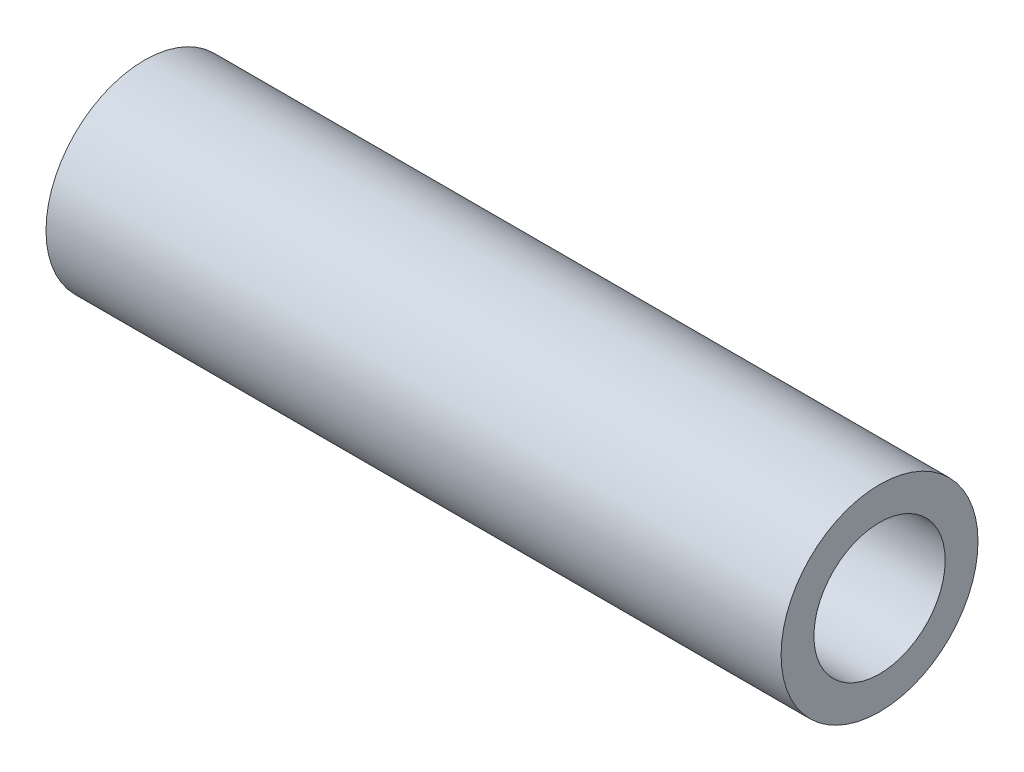
ISO-10303-21;
HEADER;
FILE_DESCRIPTION(('STEP AP214'),'2;1');
FILE_NAME('part.step','',(''),(''),'','','');
FILE_SCHEMA(('AUTOMOTIVE_DESIGN { 1 0 10303 214 1 1 1 1 }'));
ENDSEC;
DATA;
#1=APPLICATION_CONTEXT('core data for automotive mechanical design processes');
#2=APPLICATION_PROTOCOL_DEFINITION('international standard','automotive_design',2000,#1);
#3=PRODUCT_CONTEXT('',#1,'mechanical');
#4=PRODUCT('Part','Part','',(#3));
#5=PRODUCT_RELATED_PRODUCT_CATEGORY('part','',(#4));
#6=PRODUCT_DEFINITION_FORMATION('','',#4);
#7=PRODUCT_DEFINITION_CONTEXT('part definition',#1,'design');
#8=PRODUCT_DEFINITION('design','',#6,#7);
#9=PRODUCT_DEFINITION_SHAPE('','',#8);
#10=(LENGTH_UNIT() NAMED_UNIT(*) SI_UNIT(.MILLI.,.METRE.));
#11=(NAMED_UNIT(*) PLANE_ANGLE_UNIT() SI_UNIT($,.RADIAN.));
#12=(NAMED_UNIT(*) SI_UNIT($,.STERADIAN.) SOLID_ANGLE_UNIT());
#13=UNCERTAINTY_MEASURE_WITH_UNIT(LENGTH_MEASURE(1.E-05),#10,'distance_accuracy_value','');
#14=(GEOMETRIC_REPRESENTATION_CONTEXT(3) GLOBAL_UNCERTAINTY_ASSIGNED_CONTEXT((#13)) GLOBAL_UNIT_ASSIGNED_CONTEXT((#10,
#11,#12)) REPRESENTATION_CONTEXT('',''));
#15=CARTESIAN_POINT('',(0.,0.,0.));
#16=DIRECTION('',(0.,0.,1.));
#17=DIRECTION('',(1.,0.,0.));
#18=AXIS2_PLACEMENT_3D('',#15,#16,#17);
#19=CARTESIAN_POINT('',(17.78,0.,0.));
#20=DIRECTION('',(1.,0.,0.));
#21=DIRECTION('',(0.,0.,-1.));
#22=AXIS2_PLACEMENT_3D('',#19,#20,#21);
#23=PLANE('',#22);
#24=CARTESIAN_POINT('',(17.78,0.,0.));
#25=DIRECTION('',(1.,0.,0.));
#26=DIRECTION('',(0.,0.,-1.));
#27=AXIS2_PLACEMENT_3D('',#24,#25,#26);
#28=CIRCLE('',#27,2.38125);
#29=CARTESIAN_POINT('',(17.78,0.,-2.38125));
#30=VERTEX_POINT('',#29);
#31=EDGE_CURVE('E10',#30,#30,#28,.T.);
#32=ORIENTED_EDGE('',*,*,#31,.T.);
#33=EDGE_LOOP('',(#32));
#34=FACE_BOUND('',#33,.T.);
#35=CARTESIAN_POINT('',(17.78,0.,0.));
#36=DIRECTION('',(1.,0.,0.));
#37=DIRECTION('',(0.,0.,-1.));
#38=AXIS2_PLACEMENT_3D('',#35,#36,#37);
#39=CIRCLE('',#38,1.5875);
#40=CARTESIAN_POINT('',(17.78,0.,-1.5875));
#41=VERTEX_POINT('',#40);
#42=EDGE_CURVE('E43',#41,#41,#39,.T.);
#43=ORIENTED_EDGE('',*,*,#42,.F.);
#44=EDGE_LOOP('',(#43));
#45=FACE_BOUND('',#44,.T.);
#46=ADVANCED_FACE('F32',(#34,#45),#23,.T.);
#47=CARTESIAN_POINT('',(0.,0.,0.));
#48=DIRECTION('',(1.,0.,0.));
#49=DIRECTION('',(0.,0.,-1.));
#50=AXIS2_PLACEMENT_3D('',#47,#48,#49);
#51=PLANE('',#50);
#52=CARTESIAN_POINT('',(0.,0.,0.));
#53=DIRECTION('',(1.,0.,0.));
#54=DIRECTION('',(0.,0.,-1.));
#55=AXIS2_PLACEMENT_3D('',#52,#53,#54);
#56=CIRCLE('',#55,2.38125);
#57=CARTESIAN_POINT('',(0.,0.,-2.38125));
#58=VERTEX_POINT('',#57);
#59=EDGE_CURVE('E36',#58,#58,#56,.T.);
#60=ORIENTED_EDGE('',*,*,#59,.F.);
#61=EDGE_LOOP('',(#60));
#62=FACE_BOUND('',#61,.T.);
#63=CARTESIAN_POINT('',(0.,0.,0.));
#64=DIRECTION('',(1.,0.,0.));
#65=DIRECTION('',(0.,0.,-1.));
#66=AXIS2_PLACEMENT_3D('',#63,#64,#65);
#67=CIRCLE('',#66,1.5875);
#68=CARTESIAN_POINT('',(0.,0.,-1.5875));
#69=VERTEX_POINT('',#68);
#70=EDGE_CURVE('E45',#69,#69,#67,.T.);
#71=ORIENTED_EDGE('',*,*,#70,.T.);
#72=EDGE_LOOP('',(#71));
#73=FACE_BOUND('',#72,.T.);
#74=ADVANCED_FACE('F55',(#62,#73),#51,.F.);
#75=CARTESIAN_POINT('',(17.78,0.,0.));
#76=DIRECTION('',(-1.,0.,0.));
#77=DIRECTION('',(0.,0.,1.));
#78=AXIS2_PLACEMENT_3D('',#75,#76,#77);
#79=CYLINDRICAL_SURFACE('',#78,2.38125);
#80=ORIENTED_EDGE('',*,*,#31,.F.);
#81=EDGE_LOOP('',(#80));
#82=FACE_BOUND('',#81,.T.);
#83=ORIENTED_EDGE('',*,*,#59,.T.);
#84=EDGE_LOOP('',(#83));
#85=FACE_BOUND('',#84,.T.);
#86=ADVANCED_FACE('F34',(#82,#85),#79,.T.);
#87=CARTESIAN_POINT('',(17.78,0.,0.));
#88=DIRECTION('',(-1.,0.,0.));
#89=DIRECTION('',(0.,0.,1.));
#90=AXIS2_PLACEMENT_3D('',#87,#88,#89);
#91=CYLINDRICAL_SURFACE('',#90,1.5875);
#92=ORIENTED_EDGE('',*,*,#42,.T.);
#93=EDGE_LOOP('',(#92));
#94=FACE_BOUND('',#93,.T.);
#95=ORIENTED_EDGE('',*,*,#70,.F.);
#96=EDGE_LOOP('',(#95));
#97=FACE_BOUND('',#96,.T.);
#98=ADVANCED_FACE('F51',(#94,#97),#91,.F.);
#99=CLOSED_SHELL('',(#46,#74,#86,#98));
#100=MANIFOLD_SOLID_BREP('B2',#99);
#101=ADVANCED_BREP_SHAPE_REPRESENTATION('',(#18,#100),#14);
#102=SHAPE_DEFINITION_REPRESENTATION(#9,#101);
ENDSEC;
END-ISO-10303-21;
